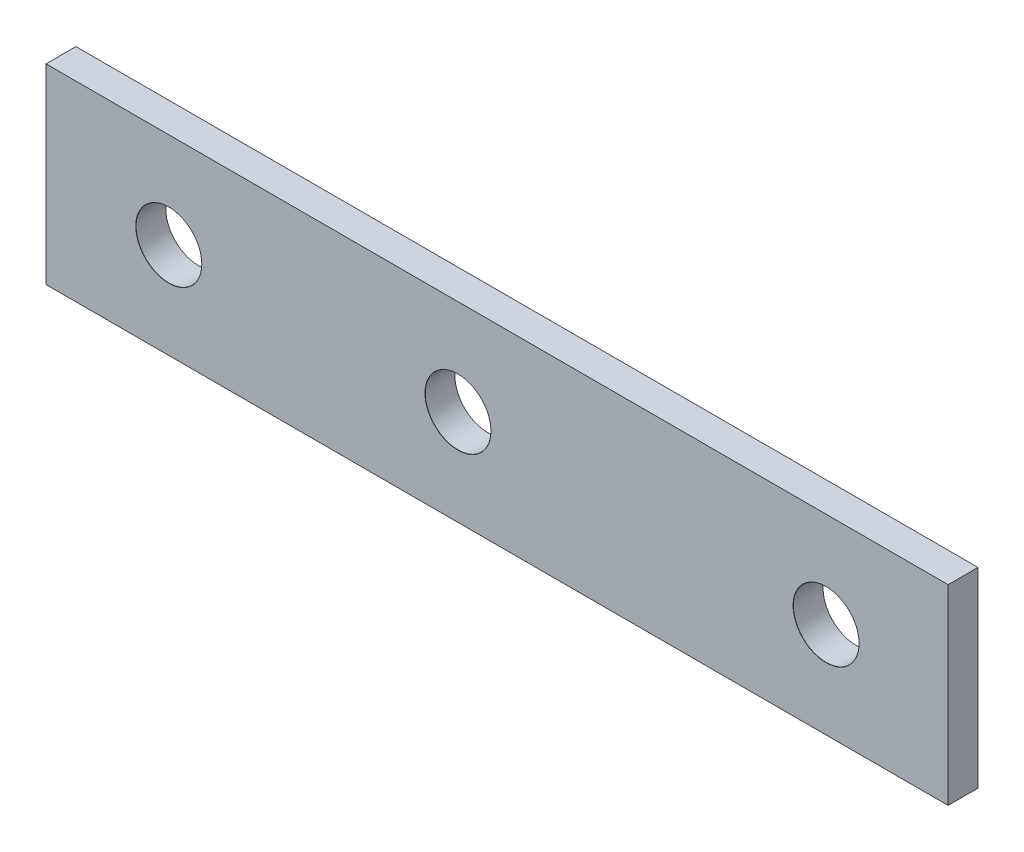
ISO-10303-21;
HEADER;
FILE_DESCRIPTION(('STEP AP214'),'2;1');
FILE_NAME('part.step','',(''),(''),'','','');
FILE_SCHEMA(('AUTOMOTIVE_DESIGN { 1 0 10303 214 1 1 1 1 }'));
ENDSEC;
DATA;
#1=APPLICATION_CONTEXT('core data for automotive mechanical design processes');
#2=APPLICATION_PROTOCOL_DEFINITION('international standard','automotive_design',2000,#1);
#3=PRODUCT_CONTEXT('',#1,'mechanical');
#4=PRODUCT('Part','Part','',(#3));
#5=PRODUCT_RELATED_PRODUCT_CATEGORY('part','',(#4));
#6=PRODUCT_DEFINITION_FORMATION('','',#4);
#7=PRODUCT_DEFINITION_CONTEXT('part definition',#1,'design');
#8=PRODUCT_DEFINITION('design','',#6,#7);
#9=PRODUCT_DEFINITION_SHAPE('','',#8);
#10=(LENGTH_UNIT() NAMED_UNIT(*) SI_UNIT(.MILLI.,.METRE.));
#11=(NAMED_UNIT(*) PLANE_ANGLE_UNIT() SI_UNIT($,.RADIAN.));
#12=(NAMED_UNIT(*) SI_UNIT($,.STERADIAN.) SOLID_ANGLE_UNIT());
#13=UNCERTAINTY_MEASURE_WITH_UNIT(LENGTH_MEASURE(1.E-05),#10,'distance_accuracy_value','');
#14=(GEOMETRIC_REPRESENTATION_CONTEXT(3) GLOBAL_UNCERTAINTY_ASSIGNED_CONTEXT((#13)) GLOBAL_UNIT_ASSIGNED_CONTEXT((#10,
#11,#12)) REPRESENTATION_CONTEXT('',''));
#15=CARTESIAN_POINT('',(0.,0.,0.));
#16=DIRECTION('',(0.,0.,1.));
#17=DIRECTION('',(1.,0.,0.));
#18=AXIS2_PLACEMENT_3D('',#15,#16,#17);
#19=CARTESIAN_POINT('',(0.,0.,5.));
#20=DIRECTION('',(1.,0.,0.));
#21=DIRECTION('',(0.,0.,-1.));
#22=AXIS2_PLACEMENT_3D('',#19,#20,#21);
#23=PLANE('',#22);
#24=DIRECTION('',(0.,-1.,0.));
#25=VECTOR('',#24,1.);
#26=CARTESIAN_POINT('',(0.,0.,0.));
#27=LINE('',#26,#25);
#28=CARTESIAN_POINT('',(0.,32.,0.));
#29=VERTEX_POINT('',#28);
#30=CARTESIAN_POINT('',(0.,0.,0.));
#31=VERTEX_POINT('',#30);
#32=EDGE_CURVE('E110',#29,#31,#27,.T.);
#33=ORIENTED_EDGE('',*,*,#32,.T.);
#34=DIRECTION('',(0.,0.,-1.));
#35=VECTOR('',#34,1.);
#36=CARTESIAN_POINT('',(0.,0.,5.));
#37=LINE('',#36,#35);
#38=CARTESIAN_POINT('',(0.,0.,5.));
#39=VERTEX_POINT('',#38);
#40=EDGE_CURVE('E11',#39,#31,#37,.T.);
#41=ORIENTED_EDGE('',*,*,#40,.F.);
#42=DIRECTION('',(0.,-1.,0.));
#43=VECTOR('',#42,1.);
#44=CARTESIAN_POINT('',(0.,0.,5.));
#45=LINE('',#44,#43);
#46=CARTESIAN_POINT('',(0.,32.,5.));
#47=VERTEX_POINT('',#46);
#48=EDGE_CURVE('E93',#47,#39,#45,.T.);
#49=ORIENTED_EDGE('',*,*,#48,.F.);
#50=DIRECTION('',(0.,0.,-1.));
#51=VECTOR('',#50,1.);
#52=CARTESIAN_POINT('',(0.,32.,5.));
#53=LINE('',#52,#51);
#54=EDGE_CURVE('E106',#47,#29,#53,.T.);
#55=ORIENTED_EDGE('',*,*,#54,.T.);
#56=EDGE_LOOP('',(#33,#41,#49,#55));
#57=FACE_BOUND('',#56,.T.);
#58=ADVANCED_FACE('F39',(#57),#23,.F.);
#59=CARTESIAN_POINT('',(0.,0.,5.));
#60=DIRECTION('',(0.,1.,0.));
#61=DIRECTION('',(-1.,0.,0.));
#62=AXIS2_PLACEMENT_3D('',#59,#60,#61);
#63=PLANE('',#62);
#64=DIRECTION('',(1.,0.,0.));
#65=VECTOR('',#64,1.);
#66=CARTESIAN_POINT('',(0.,0.,0.));
#67=LINE('',#66,#65);
#68=CARTESIAN_POINT('',(151.,0.,0.));
#69=VERTEX_POINT('',#68);
#70=EDGE_CURVE('E98',#31,#69,#67,.T.);
#71=ORIENTED_EDGE('',*,*,#70,.T.);
#72=DIRECTION('',(0.,0.,-1.));
#73=VECTOR('',#72,1.);
#74=CARTESIAN_POINT('',(151.,0.,5.));
#75=LINE('',#74,#73);
#76=CARTESIAN_POINT('',(151.,0.,5.));
#77=VERTEX_POINT('',#76);
#78=EDGE_CURVE('E49',#77,#69,#75,.T.);
#79=ORIENTED_EDGE('',*,*,#78,.F.);
#80=DIRECTION('',(1.,0.,0.));
#81=VECTOR('',#80,1.);
#82=CARTESIAN_POINT('',(0.,0.,5.));
#83=LINE('',#82,#81);
#84=EDGE_CURVE('E88',#39,#77,#83,.T.);
#85=ORIENTED_EDGE('',*,*,#84,.F.);
#86=ORIENTED_EDGE('',*,*,#40,.T.);
#87=EDGE_LOOP('',(#71,#79,#85,#86));
#88=FACE_BOUND('',#87,.T.);
#89=ADVANCED_FACE('F97',(#88),#63,.F.);
#90=CARTESIAN_POINT('',(151.,0.,5.));
#91=DIRECTION('',(-1.,0.,0.));
#92=DIRECTION('',(0.,0.,1.));
#93=AXIS2_PLACEMENT_3D('',#90,#91,#92);
#94=PLANE('',#93);
#95=DIRECTION('',(0.,1.,0.));
#96=VECTOR('',#95,1.);
#97=CARTESIAN_POINT('',(151.,0.,0.));
#98=LINE('',#97,#96);
#99=CARTESIAN_POINT('',(151.,32.,0.));
#100=VERTEX_POINT('',#99);
#101=EDGE_CURVE('E75',#69,#100,#98,.T.);
#102=ORIENTED_EDGE('',*,*,#101,.T.);
#103=DIRECTION('',(0.,0.,-1.));
#104=VECTOR('',#103,1.);
#105=CARTESIAN_POINT('',(151.,32.,5.));
#106=LINE('',#105,#104);
#107=CARTESIAN_POINT('',(151.,32.,5.));
#108=VERTEX_POINT('',#107);
#109=EDGE_CURVE('E100',#108,#100,#106,.T.);
#110=ORIENTED_EDGE('',*,*,#109,.F.);
#111=DIRECTION('',(0.,1.,0.));
#112=VECTOR('',#111,1.);
#113=CARTESIAN_POINT('',(151.,0.,5.));
#114=LINE('',#113,#112);
#115=EDGE_CURVE('E91',#77,#108,#114,.T.);
#116=ORIENTED_EDGE('',*,*,#115,.F.);
#117=ORIENTED_EDGE('',*,*,#78,.T.);
#118=EDGE_LOOP('',(#102,#110,#116,#117));
#119=FACE_BOUND('',#118,.T.);
#120=ADVANCED_FACE('F102',(#119),#94,.F.);
#121=CARTESIAN_POINT('',(0.,32.,5.));
#122=DIRECTION('',(0.,-1.,0.));
#123=DIRECTION('',(0.,0.,-1.));
#124=AXIS2_PLACEMENT_3D('',#121,#122,#123);
#125=PLANE('',#124);
#126=DIRECTION('',(-1.,0.,0.));
#127=VECTOR('',#126,1.);
#128=CARTESIAN_POINT('',(0.,32.,0.));
#129=LINE('',#128,#127);
#130=EDGE_CURVE('E81',#100,#29,#129,.T.);
#131=ORIENTED_EDGE('',*,*,#130,.T.);
#132=ORIENTED_EDGE('',*,*,#54,.F.);
#133=DIRECTION('',(-1.,0.,0.));
#134=VECTOR('',#133,1.);
#135=CARTESIAN_POINT('',(0.,32.,5.));
#136=LINE('',#135,#134);
#137=EDGE_CURVE('E58',#108,#47,#136,.T.);
#138=ORIENTED_EDGE('',*,*,#137,.F.);
#139=ORIENTED_EDGE('',*,*,#109,.T.);
#140=EDGE_LOOP('',(#131,#132,#138,#139));
#141=FACE_BOUND('',#140,.T.);
#142=ADVANCED_FACE('F165',(#141),#125,.F.);
#143=CARTESIAN_POINT('',(0.,0.,5.));
#144=DIRECTION('',(0.,0.,-1.));
#145=DIRECTION('',(-1.,0.,0.));
#146=AXIS2_PLACEMENT_3D('',#143,#144,#145);
#147=PLANE('',#146);
#148=CARTESIAN_POINT('',(20.5524652945612,16.,5.));
#149=DIRECTION('',(0.,0.,1.));
#150=DIRECTION('',(1.,0.,0.));
#151=AXIS2_PLACEMENT_3D('',#148,#149,#150);
#152=CIRCLE('',#151,5.525);
#153=CARTESIAN_POINT('',(26.0774652945612,16.,5.));
#154=VERTEX_POINT('',#153);
#155=EDGE_CURVE('E266',#154,#154,#152,.T.);
#156=ORIENTED_EDGE('',*,*,#155,.F.);
#157=EDGE_LOOP('',(#156));
#158=FACE_BOUND('',#157,.T.);
#159=CARTESIAN_POINT('',(68.9512803109181,16.,5.));
#160=DIRECTION('',(0.,0.,1.));
#161=DIRECTION('',(1.,0.,0.));
#162=AXIS2_PLACEMENT_3D('',#159,#160,#161);
#163=CIRCLE('',#162,5.525);
#164=CARTESIAN_POINT('',(74.4762803109181,16.,5.));
#165=VERTEX_POINT('',#164);
#166=EDGE_CURVE('E140',#165,#165,#163,.T.);
#167=ORIENTED_EDGE('',*,*,#166,.F.);
#168=EDGE_LOOP('',(#167));
#169=FACE_BOUND('',#168,.T.);
#170=CARTESIAN_POINT('',(130.57123503906,16.,5.));
#171=DIRECTION('',(0.,0.,1.));
#172=DIRECTION('',(1.,0.,0.));
#173=AXIS2_PLACEMENT_3D('',#170,#171,#172);
#174=CIRCLE('',#173,5.525);
#175=CARTESIAN_POINT('',(136.09623503906,16.,5.));
#176=VERTEX_POINT('',#175);
#177=EDGE_CURVE('E131',#176,#176,#174,.T.);
#178=ORIENTED_EDGE('',*,*,#177,.F.);
#179=EDGE_LOOP('',(#178));
#180=FACE_BOUND('',#179,.T.);
#181=ORIENTED_EDGE('',*,*,#48,.T.);
#182=ORIENTED_EDGE('',*,*,#84,.T.);
#183=ORIENTED_EDGE('',*,*,#115,.T.);
#184=ORIENTED_EDGE('',*,*,#137,.T.);
#185=EDGE_LOOP('',(#181,#182,#183,#184));
#186=FACE_BOUND('',#185,.T.);
#187=ADVANCED_FACE('F89',(#158,#169,#180,#186),#147,.F.);
#188=CARTESIAN_POINT('',(0.,0.,0.));
#189=DIRECTION('',(0.,0.,-1.));
#190=DIRECTION('',(-1.,0.,0.));
#191=AXIS2_PLACEMENT_3D('',#188,#189,#190);
#192=PLANE('',#191);
#193=CARTESIAN_POINT('',(20.5524652945612,16.,0.));
#194=DIRECTION('',(0.,0.,-1.));
#195=DIRECTION('',(-1.,0.,0.));
#196=AXIS2_PLACEMENT_3D('',#193,#194,#195);
#197=CIRCLE('',#196,5.49999999999999);
#198=CARTESIAN_POINT('',(15.0524652945612,16.,0.));
#199=VERTEX_POINT('',#198);
#200=EDGE_CURVE('E42',#199,#199,#197,.T.);
#201=ORIENTED_EDGE('',*,*,#200,.F.);
#202=EDGE_LOOP('',(#201));
#203=FACE_BOUND('',#202,.T.);
#204=CARTESIAN_POINT('',(68.9512803109181,16.,0.));
#205=DIRECTION('',(0.,0.,-1.));
#206=DIRECTION('',(-1.,0.,0.));
#207=AXIS2_PLACEMENT_3D('',#204,#205,#206);
#208=CIRCLE('',#207,5.49999999999999);
#209=CARTESIAN_POINT('',(63.4512803109181,16.,0.));
#210=VERTEX_POINT('',#209);
#211=EDGE_CURVE('E128',#210,#210,#208,.T.);
#212=ORIENTED_EDGE('',*,*,#211,.F.);
#213=EDGE_LOOP('',(#212));
#214=FACE_BOUND('',#213,.T.);
#215=CARTESIAN_POINT('',(130.57123503906,16.,0.));
#216=DIRECTION('',(0.,0.,-1.));
#217=DIRECTION('',(-1.,0.,0.));
#218=AXIS2_PLACEMENT_3D('',#215,#216,#217);
#219=CIRCLE('',#218,5.50000000000001);
#220=CARTESIAN_POINT('',(125.07123503906,16.,0.));
#221=VERTEX_POINT('',#220);
#222=EDGE_CURVE('E114',#221,#221,#219,.T.);
#223=ORIENTED_EDGE('',*,*,#222,.F.);
#224=EDGE_LOOP('',(#223));
#225=FACE_BOUND('',#224,.T.);
#226=ORIENTED_EDGE('',*,*,#32,.F.);
#227=ORIENTED_EDGE('',*,*,#130,.F.);
#228=ORIENTED_EDGE('',*,*,#101,.F.);
#229=ORIENTED_EDGE('',*,*,#70,.F.);
#230=EDGE_LOOP('',(#226,#227,#228,#229));
#231=FACE_BOUND('',#230,.T.);
#232=ADVANCED_FACE('F164',(#203,#214,#225,#231),#192,.T.);
#233=CARTESIAN_POINT('',(130.57123503906,16.,5.));
#234=DIRECTION('',(0.,0.,1.));
#235=DIRECTION('',(1.,0.,0.));
#236=AXIS2_PLACEMENT_3D('',#233,#234,#235);
#237=CYLINDRICAL_SURFACE('',#236,5.50000000000001);
#238=ORIENTED_EDGE('',*,*,#222,.T.);
#239=EDGE_LOOP('',(#238));
#240=FACE_BOUND('',#239,.T.);
#241=CARTESIAN_POINT('',(130.57123503906,16.,4.975));
#242=DIRECTION('',(0.,0.,1.));
#243=DIRECTION('',(1.,0.,0.));
#244=AXIS2_PLACEMENT_3D('',#241,#242,#243);
#245=CIRCLE('',#244,5.50000000000001);
#246=CARTESIAN_POINT('',(136.07123503906,16.,4.975));
#247=VERTEX_POINT('',#246);
#248=EDGE_CURVE('E127',#247,#247,#245,.T.);
#249=ORIENTED_EDGE('',*,*,#248,.T.);
#250=EDGE_LOOP('',(#249));
#251=FACE_BOUND('',#250,.T.);
#252=ADVANCED_FACE('F154',(#240,#251),#237,.F.);
#253=CARTESIAN_POINT('',(130.57123503906,16.,5.));
#254=DIRECTION('',(0.,0.,1.));
#255=DIRECTION('',(1.,0.,0.));
#256=AXIS2_PLACEMENT_3D('',#253,#254,#255);
#257=CONICAL_SURFACE('',#256,5.525,0.78539816339731);
#258=ORIENTED_EDGE('',*,*,#248,.F.);
#259=EDGE_LOOP('',(#258));
#260=FACE_BOUND('',#259,.T.);
#261=ORIENTED_EDGE('',*,*,#177,.T.);
#262=EDGE_LOOP('',(#261));
#263=FACE_BOUND('',#262,.T.);
#264=ADVANCED_FACE('F156',(#260,#263),#257,.F.);
#265=CARTESIAN_POINT('',(68.9512803109181,16.,5.));
#266=DIRECTION('',(0.,0.,1.));
#267=DIRECTION('',(1.,0.,0.));
#268=AXIS2_PLACEMENT_3D('',#265,#266,#267);
#269=CYLINDRICAL_SURFACE('',#268,5.49999999999999);
#270=ORIENTED_EDGE('',*,*,#211,.T.);
#271=EDGE_LOOP('',(#270));
#272=FACE_BOUND('',#271,.T.);
#273=CARTESIAN_POINT('',(68.9512803109181,16.,4.975));
#274=DIRECTION('',(0.,0.,1.));
#275=DIRECTION('',(1.,0.,0.));
#276=AXIS2_PLACEMENT_3D('',#273,#274,#275);
#277=CIRCLE('',#276,5.49999999999999);
#278=CARTESIAN_POINT('',(74.4512803109181,16.,4.975));
#279=VERTEX_POINT('',#278);
#280=EDGE_CURVE('E132',#279,#279,#277,.T.);
#281=ORIENTED_EDGE('',*,*,#280,.T.);
#282=EDGE_LOOP('',(#281));
#283=FACE_BOUND('',#282,.T.);
#284=ADVANCED_FACE('F159',(#272,#283),#269,.F.);
#285=CARTESIAN_POINT('',(68.9512803109181,16.,5.));
#286=DIRECTION('',(0.,0.,1.));
#287=DIRECTION('',(1.,0.,0.));
#288=AXIS2_PLACEMENT_3D('',#285,#286,#287);
#289=CONICAL_SURFACE('',#288,5.525,0.785398163397587);
#290=ORIENTED_EDGE('',*,*,#280,.F.);
#291=EDGE_LOOP('',(#290));
#292=FACE_BOUND('',#291,.T.);
#293=ORIENTED_EDGE('',*,*,#166,.T.);
#294=EDGE_LOOP('',(#293));
#295=FACE_BOUND('',#294,.T.);
#296=ADVANCED_FACE('F228',(#292,#295),#289,.F.);
#297=CARTESIAN_POINT('',(20.5524652945612,16.,5.));
#298=DIRECTION('',(0.,0.,1.));
#299=DIRECTION('',(1.,0.,0.));
#300=AXIS2_PLACEMENT_3D('',#297,#298,#299);
#301=CYLINDRICAL_SURFACE('',#300,5.49999999999999);
#302=ORIENTED_EDGE('',*,*,#200,.T.);
#303=EDGE_LOOP('',(#302));
#304=FACE_BOUND('',#303,.T.);
#305=CARTESIAN_POINT('',(20.5524652945612,16.,4.975));
#306=DIRECTION('',(0.,0.,1.));
#307=DIRECTION('',(1.,0.,0.));
#308=AXIS2_PLACEMENT_3D('',#305,#306,#307);
#309=CIRCLE('',#308,5.49999999999999);
#310=CARTESIAN_POINT('',(26.0524652945612,16.,4.975));
#311=VERTEX_POINT('',#310);
#312=EDGE_CURVE('E264',#311,#311,#309,.T.);
#313=ORIENTED_EDGE('',*,*,#312,.T.);
#314=EDGE_LOOP('',(#313));
#315=FACE_BOUND('',#314,.T.);
#316=ADVANCED_FACE('F237',(#304,#315),#301,.F.);
#317=CARTESIAN_POINT('',(20.5524652945612,16.,5.));
#318=DIRECTION('',(0.,0.,1.));
#319=DIRECTION('',(1.,0.,0.));
#320=AXIS2_PLACEMENT_3D('',#317,#318,#319);
#321=CONICAL_SURFACE('',#320,5.525,0.785398163397518);
#322=ORIENTED_EDGE('',*,*,#312,.F.);
#323=EDGE_LOOP('',(#322));
#324=FACE_BOUND('',#323,.T.);
#325=ORIENTED_EDGE('',*,*,#155,.T.);
#326=EDGE_LOOP('',(#325));
#327=FACE_BOUND('',#326,.T.);
#328=ADVANCED_FACE('F247',(#324,#327),#321,.F.);
#329=CLOSED_SHELL('',(#58,#89,#120,#142,#187,#232,#252,#264,#284,#296,#316,#328));
#330=MANIFOLD_SOLID_BREP('B2',#329);
#331=ADVANCED_BREP_SHAPE_REPRESENTATION('',(#18,#330),#14);
#332=SHAPE_DEFINITION_REPRESENTATION(#9,#331);
ENDSEC;
END-ISO-10303-21;
